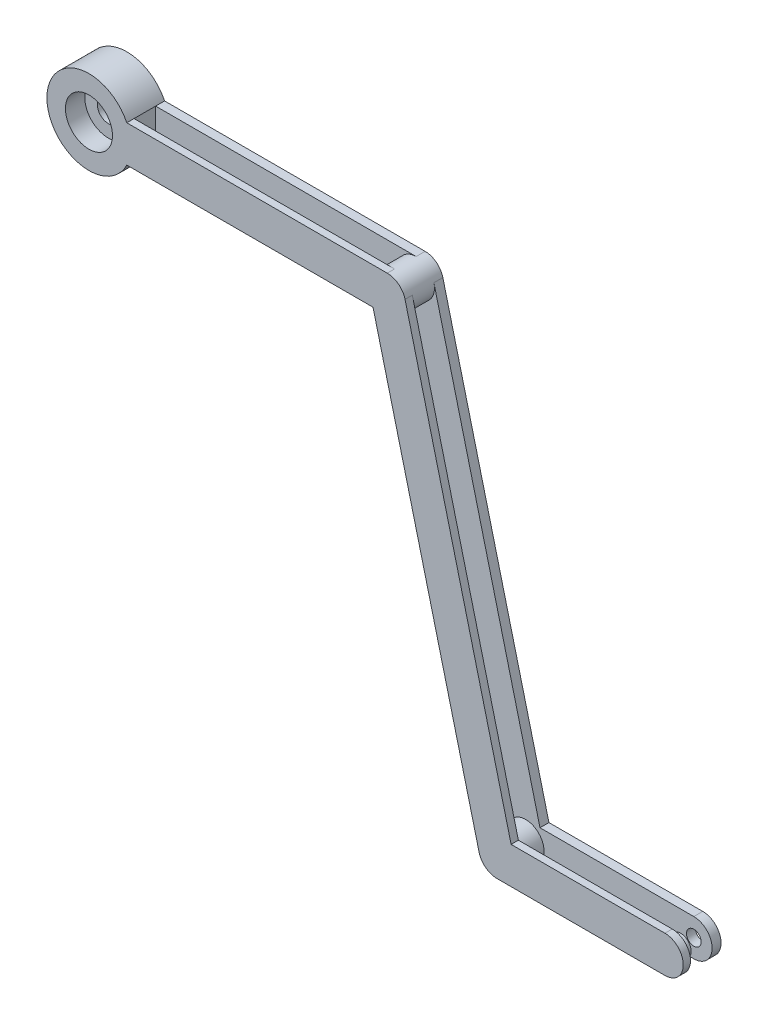
ISO-10303-21;
HEADER;
FILE_DESCRIPTION(('STEP AP214'),'2;1');
FILE_NAME('part.step','',(''),(''),'','','');
FILE_SCHEMA(('AUTOMOTIVE_DESIGN { 1 0 10303 214 1 1 1 1 }'));
ENDSEC;
DATA;
#1=APPLICATION_CONTEXT('core data for automotive mechanical design processes');
#2=APPLICATION_PROTOCOL_DEFINITION('international standard','automotive_design',2000,#1);
#3=PRODUCT_CONTEXT('',#1,'mechanical');
#4=PRODUCT('Part','Part','',(#3));
#5=PRODUCT_RELATED_PRODUCT_CATEGORY('part','',(#4));
#6=PRODUCT_DEFINITION_FORMATION('','',#4);
#7=PRODUCT_DEFINITION_CONTEXT('part definition',#1,'design');
#8=PRODUCT_DEFINITION('design','',#6,#7);
#9=PRODUCT_DEFINITION_SHAPE('','',#8);
#10=(LENGTH_UNIT() NAMED_UNIT(*) SI_UNIT(.MILLI.,.METRE.));
#11=(NAMED_UNIT(*) PLANE_ANGLE_UNIT() SI_UNIT($,.RADIAN.));
#12=(NAMED_UNIT(*) SI_UNIT($,.STERADIAN.) SOLID_ANGLE_UNIT());
#13=UNCERTAINTY_MEASURE_WITH_UNIT(LENGTH_MEASURE(1.E-05),#10,'distance_accuracy_value','');
#14=(GEOMETRIC_REPRESENTATION_CONTEXT(3) GLOBAL_UNCERTAINTY_ASSIGNED_CONTEXT((#13)) GLOBAL_UNIT_ASSIGNED_CONTEXT((#10,
#11,#12)) REPRESENTATION_CONTEXT('',''));
#15=CARTESIAN_POINT('',(0.,0.,0.));
#16=DIRECTION('',(0.,0.,1.));
#17=DIRECTION('',(1.,0.,0.));
#18=AXIS2_PLACEMENT_3D('',#15,#16,#17);
#19=CARTESIAN_POINT('',(0.,-107.358898943541,9.));
#20=DIRECTION('',(0.,1.,0.));
#21=DIRECTION('',(0.,0.,1.));
#22=AXIS2_PLACEMENT_3D('',#19,#20,#21);
#23=PLANE('',#22);
#24=DIRECTION('',(0.,0.,-1.));
#25=VECTOR('',#24,1.);
#26=CARTESIAN_POINT('',(137.080968946948,-107.358898943541,9.));
#27=LINE('',#26,#25);
#28=CARTESIAN_POINT('',(137.080968946948,-107.358898943541,0.));
#29=VERTEX_POINT('',#28);
#30=CARTESIAN_POINT('',(137.080968946948,-107.358898943541,-1.72985231859176));
#31=VERTEX_POINT('',#30);
#32=EDGE_CURVE('E11',#29,#31,#27,.T.);
#33=ORIENTED_EDGE('',*,*,#32,.F.);
#34=DIRECTION('',(-1.,0.,0.));
#35=VECTOR('',#34,1.);
#36=CARTESIAN_POINT('',(-10.,-107.358898943541,0.));
#37=LINE('',#36,#35);
#38=CARTESIAN_POINT('',(97.0809689469479,-107.358898943541,0.));
#39=VERTEX_POINT('',#38);
#40=EDGE_CURVE('E195',#29,#39,#37,.T.);
#41=ORIENTED_EDGE('',*,*,#40,.T.);
#42=DIRECTION('',(0.,0.,-1.));
#43=VECTOR('',#42,1.);
#44=CARTESIAN_POINT('',(97.0809689469479,-107.358898943541,9.));
#45=LINE('',#44,#43);
#46=CARTESIAN_POINT('',(97.0809689469479,-107.358898943541,-1.72985231859176));
#47=VERTEX_POINT('',#46);
#48=EDGE_CURVE('E205',#39,#47,#45,.T.);
#49=ORIENTED_EDGE('',*,*,#48,.T.);
#50=DIRECTION('',(-1.,0.,0.));
#51=VECTOR('',#50,1.);
#52=CARTESIAN_POINT('',(141.439867890489,-107.358898943541,-1.72985231859176));
#53=LINE('',#52,#51);
#54=EDGE_CURVE('E204',#31,#47,#53,.T.);
#55=ORIENTED_EDGE('',*,*,#54,.F.);
#56=EDGE_LOOP('',(#33,#41,#49,#55));
#57=FACE_BOUND('',#56,.T.);
#58=ADVANCED_FACE('F46',(#57),#23,.F.);
#59=CARTESIAN_POINT('',(137.080968946948,-103.,9.));
#60=DIRECTION('',(0.,0.,-1.));
#61=DIRECTION('',(-1.,0.,0.));
#62=AXIS2_PLACEMENT_3D('',#59,#60,#61);
#63=CYLINDRICAL_SURFACE('',#62,4.35889894354068);
#64=CARTESIAN_POINT('',(137.080968946948,-103.,0.));
#65=DIRECTION('',(0.,0.,-1.));
#66=DIRECTION('',(-1.,0.,0.));
#67=AXIS2_PLACEMENT_3D('',#64,#65,#66);
#68=CIRCLE('',#67,4.35889894354068);
#69=CARTESIAN_POINT('',(137.080968946948,-98.6411010564593,0.));
#70=VERTEX_POINT('',#69);
#71=EDGE_CURVE('E183',#70,#29,#68,.T.);
#72=ORIENTED_EDGE('',*,*,#71,.T.);
#73=ORIENTED_EDGE('',*,*,#32,.T.);
#74=CARTESIAN_POINT('',(137.080968946948,-103.,-1.72985231859176));
#75=DIRECTION('',(0.,0.,-1.));
#76=DIRECTION('',(-1.,0.,0.));
#77=AXIS2_PLACEMENT_3D('',#74,#75,#76);
#78=CIRCLE('',#77,4.35889894354068);
#79=CARTESIAN_POINT('',(137.080968946948,-98.6411010564593,-1.72985231859176));
#80=VERTEX_POINT('',#79);
#81=EDGE_CURVE('E271',#80,#31,#78,.T.);
#82=ORIENTED_EDGE('',*,*,#81,.F.);
#83=DIRECTION('',(0.,0.,-1.));
#84=VECTOR('',#83,1.);
#85=CARTESIAN_POINT('',(137.080968946948,-98.6411010564593,9.));
#86=LINE('',#85,#84);
#87=EDGE_CURVE('E55',#70,#80,#86,.T.);
#88=ORIENTED_EDGE('',*,*,#87,.F.);
#89=EDGE_LOOP('',(#72,#73,#82,#88));
#90=FACE_BOUND('',#89,.T.);
#91=ADVANCED_FACE('F185',(#90),#63,.T.);
#92=CARTESIAN_POINT('',(0.,-98.6411010564593,9.));
#93=DIRECTION('',(0.,1.,0.));
#94=DIRECTION('',(0.,0.,1.));
#95=AXIS2_PLACEMENT_3D('',#92,#93,#94);
#96=PLANE('',#95);
#97=DIRECTION('',(-1.,0.,0.));
#98=VECTOR('',#97,1.);
#99=CARTESIAN_POINT('',(0.,-98.6411010564593,0.));
#100=LINE('',#99,#98);
#101=CARTESIAN_POINT('',(100.473705575307,-98.6411010564593,0.));
#102=VERTEX_POINT('',#101);
#103=EDGE_CURVE('E192',#70,#102,#100,.T.);
#104=ORIENTED_EDGE('',*,*,#103,.F.);
#105=ORIENTED_EDGE('',*,*,#87,.T.);
#106=DIRECTION('',(-1.,0.,0.));
#107=VECTOR('',#106,1.);
#108=CARTESIAN_POINT('',(0.,-98.6411010564593,-1.72985231859176));
#109=LINE('',#108,#107);
#110=CARTESIAN_POINT('',(100.473705575307,-98.6411010564593,-1.72985231859176));
#111=VERTEX_POINT('',#110);
#112=EDGE_CURVE('E267',#80,#111,#109,.T.);
#113=ORIENTED_EDGE('',*,*,#112,.T.);
#114=DIRECTION('',(0.,0.,-1.));
#115=VECTOR('',#114,1.);
#116=CARTESIAN_POINT('',(100.473705575307,-98.6411010564593,9.));
#117=LINE('',#116,#115);
#118=EDGE_CURVE('E391',#102,#111,#117,.T.);
#119=ORIENTED_EDGE('',*,*,#118,.F.);
#120=EDGE_LOOP('',(#104,#105,#113,#119));
#121=FACE_BOUND('',#120,.T.);
#122=ADVANCED_FACE('F397',(#121),#96,.T.);
#123=CARTESIAN_POINT('',(70.9475272540212,17.9648568463579,9.));
#124=DIRECTION('',(0.969405133703911,0.245466263972268,0.));
#125=DIRECTION('',(-0.245466263972268,0.969405133703911,0.));
#126=AXIS2_PLACEMENT_3D('',#123,#124,#125);
#127=PLANE('',#126);
#128=DIRECTION('',(-0.245466263972268,0.969405133703911,0.));
#129=VECTOR('',#128,1.);
#130=CARTESIAN_POINT('',(70.9475272540212,17.9648568463579,0.));
#131=LINE('',#130,#129);
#132=CARTESIAN_POINT('',(75.2255390131649,1.06996263870359,0.));
#133=VERTEX_POINT('',#132);
#134=EDGE_CURVE('E408',#102,#133,#131,.T.);
#135=ORIENTED_EDGE('',*,*,#134,.F.);
#136=ORIENTED_EDGE('',*,*,#118,.T.);
#137=DIRECTION('',(-0.245466263972268,0.969405133703911,0.));
#138=VECTOR('',#137,1.);
#139=CARTESIAN_POINT('',(70.9475272540212,17.9648568463579,-1.72985231859176));
#140=LINE('',#139,#138);
#141=CARTESIAN_POINT('',(75.2255390131649,1.0699626387036,-1.72985231859176));
#142=VERTEX_POINT('',#141);
#143=EDGE_CURVE('E263',#111,#142,#140,.T.);
#144=ORIENTED_EDGE('',*,*,#143,.T.);
#145=DIRECTION('',(0.,0.,-1.));
#146=VECTOR('',#145,1.);
#147=CARTESIAN_POINT('',(75.2255390131649,1.0699626387036,9.));
#148=LINE('',#147,#146);
#149=EDGE_CURVE('E388',#133,#142,#148,.T.);
#150=ORIENTED_EDGE('',*,*,#149,.F.);
#151=EDGE_LOOP('',(#135,#136,#144,#150));
#152=FACE_BOUND('',#151,.T.);
#153=ADVANCED_FACE('F407',(#152),#127,.T.);
#154=CARTESIAN_POINT('',(0.,4.35889894354067,9.));
#155=DIRECTION('',(0.,1.,0.));
#156=DIRECTION('',(0.,0.,1.));
#157=AXIS2_PLACEMENT_3D('',#154,#155,#156);
#158=PLANE('',#157);
#159=DIRECTION('',(-1.,0.,0.));
#160=VECTOR('',#159,1.);
#161=CARTESIAN_POINT('',(0.,4.35889894354067,0.));
#162=LINE('',#161,#160);
#163=CARTESIAN_POINT('',(71.,4.35889894354067,0.));
#164=VERTEX_POINT('',#163);
#165=CARTESIAN_POINT('',(9.,4.35889894354067,0.));
#166=VERTEX_POINT('',#165);
#167=EDGE_CURVE('E416',#164,#166,#162,.T.);
#168=ORIENTED_EDGE('',*,*,#167,.F.);
#169=DIRECTION('',(0.,0.,-1.));
#170=VECTOR('',#169,1.);
#171=CARTESIAN_POINT('',(71.,4.35889894354067,9.));
#172=LINE('',#171,#170);
#173=CARTESIAN_POINT('',(71.,4.35889894354067,-1.72985231859176));
#174=VERTEX_POINT('',#173);
#175=EDGE_CURVE('E385',#164,#174,#172,.T.);
#176=ORIENTED_EDGE('',*,*,#175,.T.);
#177=DIRECTION('',(-1.,0.,0.));
#178=VECTOR('',#177,1.);
#179=CARTESIAN_POINT('',(141.439867890489,4.35889894354067,-1.72985231859176));
#180=LINE('',#179,#178);
#181=CARTESIAN_POINT('',(9.,4.35889894354067,-1.72985231859176));
#182=VERTEX_POINT('',#181);
#183=EDGE_CURVE('E224',#174,#182,#180,.T.);
#184=ORIENTED_EDGE('',*,*,#183,.T.);
#185=DIRECTION('',(0.,0.,-1.));
#186=VECTOR('',#185,1.);
#187=CARTESIAN_POINT('',(9.,4.35889894354067,9.));
#188=LINE('',#187,#186);
#189=EDGE_CURVE('E382',#166,#182,#188,.T.);
#190=ORIENTED_EDGE('',*,*,#189,.F.);
#191=EDGE_LOOP('',(#168,#176,#184,#190));
#192=FACE_BOUND('',#191,.T.);
#193=ADVANCED_FACE('F456',(#192),#158,.T.);
#194=CARTESIAN_POINT('',(0.,-4.35889894354067,9.));
#195=DIRECTION('',(0.,1.,0.));
#196=DIRECTION('',(-1.,0.,0.));
#197=AXIS2_PLACEMENT_3D('',#194,#195,#196);
#198=PLANE('',#197);
#199=DIRECTION('',(0.,0.,-1.));
#200=VECTOR('',#199,1.);
#201=CARTESIAN_POINT('',(67.6072633716404,-4.35889894354067,9.));
#202=LINE('',#201,#200);
#203=CARTESIAN_POINT('',(67.6072633716404,-4.35889894354067,0.));
#204=VERTEX_POINT('',#203);
#205=CARTESIAN_POINT('',(67.6072633716404,-4.35889894354067,-1.72985231859176));
#206=VERTEX_POINT('',#205);
#207=EDGE_CURVE('E376',#204,#206,#202,.T.);
#208=ORIENTED_EDGE('',*,*,#207,.F.);
#209=DIRECTION('',(-1.,0.,0.));
#210=VECTOR('',#209,1.);
#211=CARTESIAN_POINT('',(0.,-4.35889894354067,0.));
#212=LINE('',#211,#210);
#213=CARTESIAN_POINT('',(9.,-4.35889894354067,0.));
#214=VERTEX_POINT('',#213);
#215=EDGE_CURVE('E443',#204,#214,#212,.T.);
#216=ORIENTED_EDGE('',*,*,#215,.T.);
#217=DIRECTION('',(0.,0.,-1.));
#218=VECTOR('',#217,1.);
#219=CARTESIAN_POINT('',(9.,-4.35889894354067,9.));
#220=LINE('',#219,#218);
#221=CARTESIAN_POINT('',(9.,-4.3588989435407,-1.72985231859176));
#222=VERTEX_POINT('',#221);
#223=EDGE_CURVE('E379',#214,#222,#220,.T.);
#224=ORIENTED_EDGE('',*,*,#223,.T.);
#225=DIRECTION('',(-1.,0.,0.));
#226=VECTOR('',#225,1.);
#227=CARTESIAN_POINT('',(0.,-4.35889894354067,-1.72985231859176));
#228=LINE('',#227,#226);
#229=EDGE_CURVE('E259',#206,#222,#228,.T.);
#230=ORIENTED_EDGE('',*,*,#229,.F.);
#231=EDGE_LOOP('',(#208,#216,#224,#230));
#232=FACE_BOUND('',#231,.T.);
#233=ADVANCED_FACE('F442',(#232),#198,.F.);
#234=CARTESIAN_POINT('',(62.4964492276914,15.8249315689507,9.));
#235=DIRECTION('',(0.969405133703911,0.245466263972268,0.));
#236=DIRECTION('',(-0.245466263972268,0.969405133703911,0.));
#237=AXIS2_PLACEMENT_3D('',#234,#235,#236);
#238=PLANE('',#237);
#239=DIRECTION('',(0.,0.,-1.));
#240=VECTOR('',#239,1.);
#241=CARTESIAN_POINT('',(92.855429933783,-104.069962638704,9.));
#242=LINE('',#241,#240);
#243=CARTESIAN_POINT('',(92.855429933783,-104.069962638704,0.));
#244=VERTEX_POINT('',#243);
#245=CARTESIAN_POINT('',(92.855429933783,-104.069962638704,-1.72985231859176));
#246=VERTEX_POINT('',#245);
#247=EDGE_CURVE('E373',#244,#246,#242,.T.);
#248=ORIENTED_EDGE('',*,*,#247,.F.);
#249=DIRECTION('',(-0.245466263972268,0.969405133703911,0.));
#250=VECTOR('',#249,1.);
#251=CARTESIAN_POINT('',(62.4964492276914,15.8249315689507,0.));
#252=LINE('',#251,#250);
#253=EDGE_CURVE('E62',#244,#204,#252,.T.);
#254=ORIENTED_EDGE('',*,*,#253,.T.);
#255=ORIENTED_EDGE('',*,*,#207,.T.);
#256=DIRECTION('',(-0.245466263972268,0.969405133703911,0.));
#257=VECTOR('',#256,1.);
#258=CARTESIAN_POINT('',(62.4964492276914,15.8249315689507,-1.72985231859176));
#259=LINE('',#258,#257);
#260=EDGE_CURVE('E255',#246,#206,#259,.T.);
#261=ORIENTED_EDGE('',*,*,#260,.F.);
#262=EDGE_LOOP('',(#248,#254,#255,#261));
#263=FACE_BOUND('',#262,.T.);
#264=ADVANCED_FACE('F438',(#263),#238,.F.);
#265=CARTESIAN_POINT('',(71.,0.,9.));
#266=DIRECTION('',(0.,0.,-1.));
#267=DIRECTION('',(-1.,0.,0.));
#268=AXIS2_PLACEMENT_3D('',#265,#266,#267);
#269=CYLINDRICAL_SURFACE('',#268,4.35889894354068);
#270=ORIENTED_EDGE('',*,*,#175,.F.);
#271=CARTESIAN_POINT('',(71.,0.,0.));
#272=DIRECTION('',(0.,0.,-1.));
#273=DIRECTION('',(-1.,0.,0.));
#274=AXIS2_PLACEMENT_3D('',#271,#272,#273);
#275=CIRCLE('',#274,4.35889894354068);
#276=EDGE_CURVE('E411',#164,#133,#275,.T.);
#277=ORIENTED_EDGE('',*,*,#276,.T.);
#278=ORIENTED_EDGE('',*,*,#149,.T.);
#279=CARTESIAN_POINT('',(71.,0.,-1.72985231859176));
#280=DIRECTION('',(0.,0.,-1.));
#281=DIRECTION('',(-1.,0.,0.));
#282=AXIS2_PLACEMENT_3D('',#279,#280,#281);
#283=CIRCLE('',#282,4.35889894354068);
#284=EDGE_CURVE('E221',#174,#142,#283,.F.);
#285=ORIENTED_EDGE('',*,*,#284,.F.);
#286=EDGE_LOOP('',(#270,#277,#278,#285));
#287=FACE_BOUND('',#286,.T.);
#288=DIRECTION('',(0.,0.,1.));
#289=VECTOR('',#288,1.);
#290=CARTESIAN_POINT('',(75.2255390131649,1.0699626387036,-9.));
#291=LINE('',#290,#289);
#292=CARTESIAN_POINT('',(75.2255390131649,1.0699626387036,-9.));
#293=VERTEX_POINT('',#292);
#294=CARTESIAN_POINT('',(75.2255390131649,1.06996263870359,-6.86957819147113));
#295=VERTEX_POINT('',#294);
#296=EDGE_CURVE('E342',#293,#295,#291,.T.);
#297=ORIENTED_EDGE('',*,*,#296,.F.);
#298=CARTESIAN_POINT('',(71.,0.,-9.));
#299=DIRECTION('',(0.,0.,1.));
#300=DIRECTION('',(1.,0.,0.));
#301=AXIS2_PLACEMENT_3D('',#298,#299,#300);
#302=CIRCLE('',#301,4.35889894354068);
#303=CARTESIAN_POINT('',(71.,4.35889894354067,-9.));
#304=VERTEX_POINT('',#303);
#305=EDGE_CURVE('E297',#293,#304,#302,.T.);
#306=ORIENTED_EDGE('',*,*,#305,.T.);
#307=DIRECTION('',(0.,0.,1.));
#308=VECTOR('',#307,1.);
#309=CARTESIAN_POINT('',(71.,4.35889894354067,-9.));
#310=LINE('',#309,#308);
#311=CARTESIAN_POINT('',(71.,4.35889894354067,-6.86957819147113));
#312=VERTEX_POINT('',#311);
#313=EDGE_CURVE('E338',#304,#312,#310,.T.);
#314=ORIENTED_EDGE('',*,*,#313,.T.);
#315=CARTESIAN_POINT('',(71.,0.,-6.86957819147113));
#316=DIRECTION('',(0.,0.,1.));
#317=DIRECTION('',(1.,0.,0.));
#318=AXIS2_PLACEMENT_3D('',#315,#316,#317);
#319=CIRCLE('',#318,4.35889894354068);
#320=EDGE_CURVE('E358',#312,#295,#319,.T.);
#321=ORIENTED_EDGE('',*,*,#320,.T.);
#322=EDGE_LOOP('',(#297,#306,#314,#321));
#323=FACE_BOUND('',#322,.T.);
#324=ADVANCED_FACE('F460',(#287,#323),#269,.T.);
#325=CARTESIAN_POINT('',(0.,0.,9.));
#326=DIRECTION('',(0.,0.,-1.));
#327=DIRECTION('',(-1.,0.,0.));
#328=AXIS2_PLACEMENT_3D('',#325,#326,#327);
#329=CYLINDRICAL_SURFACE('',#328,10.);
#330=CARTESIAN_POINT('',(0.,0.,0.));
#331=DIRECTION('',(0.,0.,-1.));
#332=DIRECTION('',(-1.,0.,0.));
#333=AXIS2_PLACEMENT_3D('',#330,#331,#332);
#334=CIRCLE('',#333,10.);
#335=EDGE_CURVE('E462',#214,#166,#334,.T.);
#336=ORIENTED_EDGE('',*,*,#335,.T.);
#337=ORIENTED_EDGE('',*,*,#189,.T.);
#338=DIRECTION('',(0.,0.,-1.));
#339=VECTOR('',#338,1.);
#340=CARTESIAN_POINT('',(9.,4.35889894354067,-1.72985231859176));
#341=LINE('',#340,#339);
#342=CARTESIAN_POINT('',(9.,4.35889894354067,-6.86957819147113));
#343=VERTEX_POINT('',#342);
#344=EDGE_CURVE('E218',#182,#343,#341,.T.);
#345=ORIENTED_EDGE('',*,*,#344,.T.);
#346=DIRECTION('',(0.,0.,1.));
#347=VECTOR('',#346,1.);
#348=CARTESIAN_POINT('',(9.,4.35889894354067,-9.));
#349=LINE('',#348,#347);
#350=CARTESIAN_POINT('',(9.,4.35889894354067,-9.));
#351=VERTEX_POINT('',#350);
#352=EDGE_CURVE('E334',#351,#343,#349,.T.);
#353=ORIENTED_EDGE('',*,*,#352,.F.);
#354=CARTESIAN_POINT('',(0.,0.,-9.));
#355=DIRECTION('',(0.,0.,1.));
#356=DIRECTION('',(1.,0.,0.));
#357=AXIS2_PLACEMENT_3D('',#354,#355,#356);
#358=CIRCLE('',#357,10.);
#359=CARTESIAN_POINT('',(9.,-4.35889894354067,-9.));
#360=VERTEX_POINT('',#359);
#361=EDGE_CURVE('E304',#351,#360,#358,.T.);
#362=ORIENTED_EDGE('',*,*,#361,.T.);
#363=DIRECTION('',(0.,0.,1.));
#364=VECTOR('',#363,1.);
#365=CARTESIAN_POINT('',(9.,-4.35889894354067,-9.));
#366=LINE('',#365,#364);
#367=CARTESIAN_POINT('',(9.,-4.3588989435407,-6.86957819147113));
#368=VERTEX_POINT('',#367);
#369=EDGE_CURVE('E330',#360,#368,#366,.T.);
#370=ORIENTED_EDGE('',*,*,#369,.T.);
#371=EDGE_CURVE('E329',#368,#222,#366,.T.);
#372=ORIENTED_EDGE('',*,*,#371,.T.);
#373=ORIENTED_EDGE('',*,*,#223,.F.);
#374=EDGE_LOOP('',(#336,#337,#345,#353,#362,#370,#372,#373));
#375=FACE_BOUND('',#374,.T.);
#376=ADVANCED_FACE('F502',(#375),#329,.T.);
#377=CARTESIAN_POINT('',(97.0809689469479,-103.,9.));
#378=DIRECTION('',(0.,0.,-1.));
#379=DIRECTION('',(-1.,0.,0.));
#380=AXIS2_PLACEMENT_3D('',#377,#378,#379);
#381=CYLINDRICAL_SURFACE('',#380,4.35889894354068);
#382=ORIENTED_EDGE('',*,*,#48,.F.);
#383=CARTESIAN_POINT('',(97.0809689469479,-103.,0.));
#384=DIRECTION('',(0.,0.,-1.));
#385=DIRECTION('',(-1.,0.,0.));
#386=AXIS2_PLACEMENT_3D('',#383,#384,#385);
#387=CIRCLE('',#386,4.35889894354068);
#388=EDGE_CURVE('E197',#39,#244,#387,.T.);
#389=ORIENTED_EDGE('',*,*,#388,.T.);
#390=ORIENTED_EDGE('',*,*,#247,.T.);
#391=CARTESIAN_POINT('',(97.0809689469479,-103.,-1.72985231859176));
#392=DIRECTION('',(0.,0.,-1.));
#393=DIRECTION('',(-1.,0.,0.));
#394=AXIS2_PLACEMENT_3D('',#391,#392,#393);
#395=CIRCLE('',#394,4.35889894354069);
#396=EDGE_CURVE('E430',#47,#246,#395,.F.);
#397=ORIENTED_EDGE('',*,*,#396,.F.);
#398=EDGE_LOOP('',(#382,#389,#390,#397));
#399=FACE_BOUND('',#398,.T.);
#400=DIRECTION('',(0.,0.,1.));
#401=VECTOR('',#400,1.);
#402=CARTESIAN_POINT('',(92.855429933783,-104.069962638704,-9.));
#403=LINE('',#402,#401);
#404=CARTESIAN_POINT('',(92.855429933783,-104.069962638704,-9.));
#405=VERTEX_POINT('',#404);
#406=CARTESIAN_POINT('',(92.855429933783,-104.069962638704,-6.86957819147113));
#407=VERTEX_POINT('',#406);
#408=EDGE_CURVE('E321',#405,#407,#403,.T.);
#409=ORIENTED_EDGE('',*,*,#408,.F.);
#410=CARTESIAN_POINT('',(97.0809689469479,-103.,-9.));
#411=DIRECTION('',(0.,0.,1.));
#412=DIRECTION('',(1.,0.,0.));
#413=AXIS2_PLACEMENT_3D('',#410,#411,#412);
#414=CIRCLE('',#413,4.35889894354068);
#415=CARTESIAN_POINT('',(97.0809689469479,-107.358898943541,-9.));
#416=VERTEX_POINT('',#415);
#417=EDGE_CURVE('E70',#405,#416,#414,.T.);
#418=ORIENTED_EDGE('',*,*,#417,.T.);
#419=DIRECTION('',(0.,0.,1.));
#420=VECTOR('',#419,1.);
#421=CARTESIAN_POINT('',(97.0809689469479,-107.358898943541,-9.));
#422=LINE('',#421,#420);
#423=CARTESIAN_POINT('',(97.0809689469479,-107.358898943541,-6.86957819147113));
#424=VERTEX_POINT('',#423);
#425=EDGE_CURVE('E318',#416,#424,#422,.T.);
#426=ORIENTED_EDGE('',*,*,#425,.T.);
#427=CARTESIAN_POINT('',(97.0809689469479,-103.,-6.86957819147113));
#428=DIRECTION('',(0.,0.,1.));
#429=DIRECTION('',(1.,0.,0.));
#430=AXIS2_PLACEMENT_3D('',#427,#428,#429);
#431=CIRCLE('',#430,4.35889894354069);
#432=EDGE_CURVE('E364',#424,#407,#431,.T.);
#433=ORIENTED_EDGE('',*,*,#432,.T.);
#434=EDGE_LOOP('',(#409,#418,#426,#433));
#435=FACE_BOUND('',#434,.T.);
#436=ADVANCED_FACE('F507',(#399,#435),#381,.T.);
#437=CARTESIAN_POINT('',(0.,0.,4.6));
#438=DIRECTION('',(0.,0.,-1.));
#439=DIRECTION('',(-1.,0.,0.));
#440=AXIS2_PLACEMENT_3D('',#437,#438,#439);
#441=CYLINDRICAL_SURFACE('',#440,5.6);
#442=CARTESIAN_POINT('',(0.,0.,0.));
#443=DIRECTION('',(0.,0.,-1.));
#444=DIRECTION('',(-1.,0.,0.));
#445=AXIS2_PLACEMENT_3D('',#442,#443,#444);
#446=CIRCLE('',#445,5.6);
#447=CARTESIAN_POINT('',(-5.6,0.,0.));
#448=VERTEX_POINT('',#447);
#449=EDGE_CURVE('E49',#448,#448,#446,.F.);
#450=ORIENTED_EDGE('',*,*,#449,.T.);
#451=EDGE_LOOP('',(#450));
#452=FACE_BOUND('',#451,.T.);
#453=CARTESIAN_POINT('',(0.,0.,-4.6));
#454=DIRECTION('',(0.,0.,-1.));
#455=DIRECTION('',(-1.,0.,0.));
#456=AXIS2_PLACEMENT_3D('',#453,#454,#455);
#457=CIRCLE('',#456,5.6);
#458=CARTESIAN_POINT('',(-5.6,0.,-4.6));
#459=VERTEX_POINT('',#458);
#460=EDGE_CURVE('E279',#459,#459,#457,.T.);
#461=ORIENTED_EDGE('',*,*,#460,.T.);
#462=EDGE_LOOP('',(#461));
#463=FACE_BOUND('',#462,.T.);
#464=ADVANCED_FACE('F476',(#452,#463),#441,.F.);
#465=CARTESIAN_POINT('',(0.,-107.358898943541,-9.));
#466=DIRECTION('',(0.,1.,0.));
#467=DIRECTION('',(0.,0.,-1.));
#468=AXIS2_PLACEMENT_3D('',#465,#466,#467);
#469=PLANE('',#468);
#470=ORIENTED_EDGE('',*,*,#425,.F.);
#471=DIRECTION('',(1.,0.,0.));
#472=VECTOR('',#471,1.);
#473=CARTESIAN_POINT('',(0.,-107.358898943541,-9.));
#474=LINE('',#473,#472);
#475=CARTESIAN_POINT('',(137.080968946948,-107.358898943541,-9.));
#476=VERTEX_POINT('',#475);
#477=EDGE_CURVE('E283',#416,#476,#474,.T.);
#478=ORIENTED_EDGE('',*,*,#477,.T.);
#479=DIRECTION('',(0.,0.,1.));
#480=VECTOR('',#479,1.);
#481=CARTESIAN_POINT('',(137.080968946948,-107.358898943541,-9.));
#482=LINE('',#481,#480);
#483=CARTESIAN_POINT('',(137.080968946948,-107.358898943541,-6.86957819147113));
#484=VERTEX_POINT('',#483);
#485=EDGE_CURVE('E354',#476,#484,#482,.T.);
#486=ORIENTED_EDGE('',*,*,#485,.T.);
#487=DIRECTION('',(1.,0.,0.));
#488=VECTOR('',#487,1.);
#489=CARTESIAN_POINT('',(9.,-107.358898943541,-6.86957819147113));
#490=LINE('',#489,#488);
#491=EDGE_CURVE('E210',#424,#484,#490,.T.);
#492=ORIENTED_EDGE('',*,*,#491,.F.);
#493=EDGE_LOOP('',(#470,#478,#486,#492));
#494=FACE_BOUND('',#493,.T.);
#495=ADVANCED_FACE('F515',(#494),#469,.F.);
#496=CARTESIAN_POINT('',(137.080968946948,-103.,-9.));
#497=DIRECTION('',(0.,0.,1.));
#498=DIRECTION('',(-1.,0.,0.));
#499=AXIS2_PLACEMENT_3D('',#496,#497,#498);
#500=CYLINDRICAL_SURFACE('',#499,4.35889894354068);
#501=CARTESIAN_POINT('',(137.080968946948,-103.,-6.86957819147113));
#502=DIRECTION('',(0.,0.,1.));
#503=DIRECTION('',(1.,0.,0.));
#504=AXIS2_PLACEMENT_3D('',#501,#502,#503);
#505=CIRCLE('',#504,4.35889894354068);
#506=CARTESIAN_POINT('',(137.080968946948,-98.6411010564593,-6.86957819147113));
#507=VERTEX_POINT('',#506);
#508=EDGE_CURVE('E251',#484,#507,#505,.T.);
#509=ORIENTED_EDGE('',*,*,#508,.F.);
#510=ORIENTED_EDGE('',*,*,#485,.F.);
#511=CARTESIAN_POINT('',(137.080968946948,-103.,-9.));
#512=DIRECTION('',(0.,0.,1.));
#513=DIRECTION('',(1.,0.,0.));
#514=AXIS2_PLACEMENT_3D('',#511,#512,#513);
#515=CIRCLE('',#514,4.35889894354068);
#516=CARTESIAN_POINT('',(137.080968946948,-98.6411010564593,-9.));
#517=VERTEX_POINT('',#516);
#518=EDGE_CURVE('E287',#476,#517,#515,.T.);
#519=ORIENTED_EDGE('',*,*,#518,.T.);
#520=DIRECTION('',(0.,0.,1.));
#521=VECTOR('',#520,1.);
#522=CARTESIAN_POINT('',(137.080968946948,-98.6411010564593,-9.));
#523=LINE('',#522,#521);
#524=EDGE_CURVE('E350',#517,#507,#523,.T.);
#525=ORIENTED_EDGE('',*,*,#524,.T.);
#526=EDGE_LOOP('',(#509,#510,#519,#525));
#527=FACE_BOUND('',#526,.T.);
#528=ADVANCED_FACE('F518',(#527),#500,.T.);
#529=CARTESIAN_POINT('',(0.,-98.6411010564593,-9.));
#530=DIRECTION('',(0.,1.,0.));
#531=DIRECTION('',(0.,0.,-1.));
#532=AXIS2_PLACEMENT_3D('',#529,#530,#531);
#533=PLANE('',#532);
#534=DIRECTION('',(1.,0.,0.));
#535=VECTOR('',#534,1.);
#536=CARTESIAN_POINT('',(0.,-98.6411010564593,-6.86957819147113));
#537=LINE('',#536,#535);
#538=CARTESIAN_POINT('',(100.473705575307,-98.6411010564593,-6.86957819147113));
#539=VERTEX_POINT('',#538);
#540=EDGE_CURVE('E248',#539,#507,#537,.T.);
#541=ORIENTED_EDGE('',*,*,#540,.T.);
#542=ORIENTED_EDGE('',*,*,#524,.F.);
#543=DIRECTION('',(1.,0.,0.));
#544=VECTOR('',#543,1.);
#545=CARTESIAN_POINT('',(0.,-98.6411010564593,-9.));
#546=LINE('',#545,#544);
#547=CARTESIAN_POINT('',(100.473705575307,-98.6411010564593,-9.));
#548=VERTEX_POINT('',#547);
#549=EDGE_CURVE('E291',#548,#517,#546,.T.);
#550=ORIENTED_EDGE('',*,*,#549,.F.);
#551=DIRECTION('',(0.,0.,1.));
#552=VECTOR('',#551,1.);
#553=CARTESIAN_POINT('',(100.473705575307,-98.6411010564593,-9.));
#554=LINE('',#553,#552);
#555=EDGE_CURVE('E346',#548,#539,#554,.T.);
#556=ORIENTED_EDGE('',*,*,#555,.T.);
#557=EDGE_LOOP('',(#541,#542,#550,#556));
#558=FACE_BOUND('',#557,.T.);
#559=ADVANCED_FACE('F522',(#558),#533,.T.);
#560=CARTESIAN_POINT('',(70.9475272540212,17.9648568463579,-9.));
#561=DIRECTION('',(0.969405133703911,0.245466263972268,0.));
#562=DIRECTION('',(-0.245466263972268,0.969405133703911,0.));
#563=AXIS2_PLACEMENT_3D('',#560,#561,#562);
#564=PLANE('',#563);
#565=DIRECTION('',(0.245466263972268,-0.969405133703911,0.));
#566=VECTOR('',#565,1.);
#567=CARTESIAN_POINT('',(70.9475272540212,17.9648568463579,-6.86957819147113));
#568=LINE('',#567,#566);
#569=EDGE_CURVE('E245',#295,#539,#568,.T.);
#570=ORIENTED_EDGE('',*,*,#569,.T.);
#571=ORIENTED_EDGE('',*,*,#555,.F.);
#572=DIRECTION('',(0.245466263972268,-0.969405133703911,0.));
#573=VECTOR('',#572,1.);
#574=CARTESIAN_POINT('',(70.9475272540212,17.9648568463579,-9.));
#575=LINE('',#574,#573);
#576=EDGE_CURVE('E294',#293,#548,#575,.T.);
#577=ORIENTED_EDGE('',*,*,#576,.F.);
#578=ORIENTED_EDGE('',*,*,#296,.T.);
#579=EDGE_LOOP('',(#570,#571,#577,#578));
#580=FACE_BOUND('',#579,.T.);
#581=ADVANCED_FACE('F526',(#580),#564,.T.);
#582=CARTESIAN_POINT('',(0.,4.35889894354067,-9.));
#583=DIRECTION('',(0.,1.,0.));
#584=DIRECTION('',(0.,0.,-1.));
#585=AXIS2_PLACEMENT_3D('',#582,#583,#584);
#586=PLANE('',#585);
#587=DIRECTION('',(1.,0.,0.));
#588=VECTOR('',#587,1.);
#589=CARTESIAN_POINT('',(9.,4.35889894354067,-6.86957819147113));
#590=LINE('',#589,#588);
#591=EDGE_CURVE('E211',#343,#312,#590,.T.);
#592=ORIENTED_EDGE('',*,*,#591,.T.);
#593=ORIENTED_EDGE('',*,*,#313,.F.);
#594=DIRECTION('',(1.,0.,0.));
#595=VECTOR('',#594,1.);
#596=CARTESIAN_POINT('',(0.,4.35889894354067,-9.));
#597=LINE('',#596,#595);
#598=EDGE_CURVE('E301',#351,#304,#597,.T.);
#599=ORIENTED_EDGE('',*,*,#598,.F.);
#600=ORIENTED_EDGE('',*,*,#352,.T.);
#601=EDGE_LOOP('',(#592,#593,#599,#600));
#602=FACE_BOUND('',#601,.T.);
#603=ADVANCED_FACE('F530',(#602),#586,.T.);
#604=CARTESIAN_POINT('',(0.,-4.35889894354067,-9.));
#605=DIRECTION('',(0.,1.,0.));
#606=DIRECTION('',(-1.,0.,0.));
#607=AXIS2_PLACEMENT_3D('',#604,#605,#606);
#608=PLANE('',#607);
#609=ORIENTED_EDGE('',*,*,#369,.F.);
#610=DIRECTION('',(1.,0.,0.));
#611=VECTOR('',#610,1.);
#612=CARTESIAN_POINT('',(0.,-4.35889894354067,-9.));
#613=LINE('',#612,#611);
#614=CARTESIAN_POINT('',(67.6072633716404,-4.35889894354067,-9.));
#615=VERTEX_POINT('',#614);
#616=EDGE_CURVE('E308',#360,#615,#613,.T.);
#617=ORIENTED_EDGE('',*,*,#616,.T.);
#618=DIRECTION('',(0.,0.,1.));
#619=VECTOR('',#618,1.);
#620=CARTESIAN_POINT('',(67.6072633716404,-4.35889894354067,-9.));
#621=LINE('',#620,#619);
#622=CARTESIAN_POINT('',(67.6072633716404,-4.35889894354067,-6.86957819147113));
#623=VERTEX_POINT('',#622);
#624=EDGE_CURVE('E325',#615,#623,#621,.T.);
#625=ORIENTED_EDGE('',*,*,#624,.T.);
#626=DIRECTION('',(1.,0.,0.));
#627=VECTOR('',#626,1.);
#628=CARTESIAN_POINT('',(0.,-4.35889894354067,-6.86957819147113));
#629=LINE('',#628,#627);
#630=EDGE_CURVE('E241',#368,#623,#629,.T.);
#631=ORIENTED_EDGE('',*,*,#630,.F.);
#632=EDGE_LOOP('',(#609,#617,#625,#631));
#633=FACE_BOUND('',#632,.T.);
#634=ADVANCED_FACE('F534',(#633),#608,.F.);
#635=CARTESIAN_POINT('',(62.4964492276914,15.8249315689507,-9.));
#636=DIRECTION('',(0.969405133703911,0.245466263972268,0.));
#637=DIRECTION('',(-0.245466263972268,0.969405133703911,0.));
#638=AXIS2_PLACEMENT_3D('',#635,#636,#637);
#639=PLANE('',#638);
#640=ORIENTED_EDGE('',*,*,#624,.F.);
#641=DIRECTION('',(0.245466263972268,-0.969405133703911,0.));
#642=VECTOR('',#641,1.);
#643=CARTESIAN_POINT('',(62.4964492276914,15.8249315689507,-9.));
#644=LINE('',#643,#642);
#645=EDGE_CURVE('E312',#615,#405,#644,.T.);
#646=ORIENTED_EDGE('',*,*,#645,.T.);
#647=ORIENTED_EDGE('',*,*,#408,.T.);
#648=DIRECTION('',(0.245466263972268,-0.969405133703911,0.));
#649=VECTOR('',#648,1.);
#650=CARTESIAN_POINT('',(62.4964492276914,15.8249315689507,-6.86957819147113));
#651=LINE('',#650,#649);
#652=EDGE_CURVE('E234',#623,#407,#651,.T.);
#653=ORIENTED_EDGE('',*,*,#652,.F.);
#654=EDGE_LOOP('',(#640,#646,#647,#653));
#655=FACE_BOUND('',#654,.T.);
#656=ADVANCED_FACE('F538',(#655),#639,.F.);
#657=CARTESIAN_POINT('',(0.,0.,-9.));
#658=DIRECTION('',(0.,0.,-1.));
#659=DIRECTION('',(1.,0.,0.));
#660=AXIS2_PLACEMENT_3D('',#657,#658,#659);
#661=PLANE('',#660);
#662=CARTESIAN_POINT('',(137.080968946948,-103.,-9.));
#663=DIRECTION('',(0.,0.,1.));
#664=DIRECTION('',(1.,0.,0.));
#665=AXIS2_PLACEMENT_3D('',#662,#663,#664);
#666=CIRCLE('',#665,1.75000000000001);
#667=CARTESIAN_POINT('',(138.830968946948,-103.,-9.));
#668=VERTEX_POINT('',#667);
#669=EDGE_CURVE('E191',#668,#668,#666,.T.);
#670=ORIENTED_EDGE('',*,*,#669,.T.);
#671=EDGE_LOOP('',(#670));
#672=FACE_BOUND('',#671,.T.);
#673=ORIENTED_EDGE('',*,*,#645,.F.);
#674=ORIENTED_EDGE('',*,*,#616,.F.);
#675=ORIENTED_EDGE('',*,*,#361,.F.);
#676=ORIENTED_EDGE('',*,*,#598,.T.);
#677=ORIENTED_EDGE('',*,*,#305,.F.);
#678=ORIENTED_EDGE('',*,*,#576,.T.);
#679=ORIENTED_EDGE('',*,*,#549,.T.);
#680=ORIENTED_EDGE('',*,*,#518,.F.);
#681=ORIENTED_EDGE('',*,*,#477,.F.);
#682=ORIENTED_EDGE('',*,*,#417,.F.);
#683=EDGE_LOOP('',(#673,#674,#675,#676,#677,#678,#679,#680,#681,#682));
#684=FACE_BOUND('',#683,.T.);
#685=CARTESIAN_POINT('',(0.,0.,-9.));
#686=DIRECTION('',(0.,0.,1.));
#687=DIRECTION('',(1.,0.,0.));
#688=AXIS2_PLACEMENT_3D('',#685,#686,#687);
#689=CIRCLE('',#688,2.6);
#690=CARTESIAN_POINT('',(2.6,0.,-9.));
#691=VERTEX_POINT('',#690);
#692=EDGE_CURVE('E274',#691,#691,#689,.T.);
#693=ORIENTED_EDGE('',*,*,#692,.T.);
#694=EDGE_LOOP('',(#693));
#695=FACE_BOUND('',#694,.T.);
#696=ADVANCED_FACE('F542',(#672,#684,#695),#661,.T.);
#697=CARTESIAN_POINT('',(0.,0.,-4.6));
#698=DIRECTION('',(0.,0.,1.));
#699=DIRECTION('',(-1.,0.,0.));
#700=AXIS2_PLACEMENT_3D('',#697,#698,#699);
#701=PLANE('',#700);
#702=CARTESIAN_POINT('',(0.,0.,-4.6));
#703=DIRECTION('',(0.,0.,-1.));
#704=DIRECTION('',(-1.,0.,0.));
#705=AXIS2_PLACEMENT_3D('',#702,#703,#704);
#706=CIRCLE('',#705,2.6);
#707=CARTESIAN_POINT('',(-2.6,0.,-4.6));
#708=VERTEX_POINT('',#707);
#709=EDGE_CURVE('E278',#708,#708,#706,.T.);
#710=ORIENTED_EDGE('',*,*,#709,.T.);
#711=EDGE_LOOP('',(#710));
#712=FACE_BOUND('',#711,.T.);
#713=ORIENTED_EDGE('',*,*,#460,.F.);
#714=EDGE_LOOP('',(#713));
#715=FACE_BOUND('',#714,.T.);
#716=ADVANCED_FACE('F546',(#712,#715),#701,.T.);
#717=CARTESIAN_POINT('',(0.,0.,0.));
#718=DIRECTION('',(0.,0.,-1.));
#719=DIRECTION('',(1.,0.,0.));
#720=AXIS2_PLACEMENT_3D('',#717,#718,#719);
#721=CYLINDRICAL_SURFACE('',#720,2.6);
#722=ORIENTED_EDGE('',*,*,#709,.F.);
#723=EDGE_LOOP('',(#722));
#724=FACE_BOUND('',#723,.T.);
#725=ORIENTED_EDGE('',*,*,#692,.F.);
#726=EDGE_LOOP('',(#725));
#727=FACE_BOUND('',#726,.T.);
#728=ADVANCED_FACE('F550',(#724,#727),#721,.F.);
#729=CARTESIAN_POINT('',(9.,-107.358898943541,-1.72985231859176));
#730=DIRECTION('',(-1.,0.,0.));
#731=DIRECTION('',(0.,0.,-1.));
#732=AXIS2_PLACEMENT_3D('',#729,#730,#731);
#733=PLANE('',#732);
#734=DIRECTION('',(0.,1.,0.));
#735=VECTOR('',#734,1.);
#736=CARTESIAN_POINT('',(9.,-107.358898943541,-1.72985231859176));
#737=LINE('',#736,#735);
#738=EDGE_CURVE('E216',#222,#182,#737,.T.);
#739=ORIENTED_EDGE('',*,*,#738,.F.);
#740=ORIENTED_EDGE('',*,*,#371,.F.);
#741=DIRECTION('',(0.,1.,0.));
#742=VECTOR('',#741,1.);
#743=CARTESIAN_POINT('',(9.,-107.358898943541,-6.86957819147113));
#744=LINE('',#743,#742);
#745=EDGE_CURVE('E231',#368,#343,#744,.T.);
#746=ORIENTED_EDGE('',*,*,#745,.T.);
#747=ORIENTED_EDGE('',*,*,#344,.F.);
#748=EDGE_LOOP('',(#739,#740,#746,#747));
#749=FACE_BOUND('',#748,.T.);
#750=ADVANCED_FACE('F450',(#749),#733,.F.);
#751=CARTESIAN_POINT('',(141.439867890489,-107.358898943541,-1.72985231859176));
#752=DIRECTION('',(0.,0.,1.));
#753=DIRECTION('',(-1.,0.,0.));
#754=AXIS2_PLACEMENT_3D('',#751,#752,#753);
#755=PLANE('',#754);
#756=CARTESIAN_POINT('',(137.080968946948,-103.,-1.72985231859176));
#757=DIRECTION('',(0.,0.,-1.));
#758=DIRECTION('',(-1.,0.,0.));
#759=AXIS2_PLACEMENT_3D('',#756,#757,#758);
#760=CIRCLE('',#759,2.5);
#761=CARTESIAN_POINT('',(134.580968946948,-103.,-1.72985231859176));
#762=VERTEX_POINT('',#761);
#763=EDGE_CURVE('E367',#762,#762,#760,.F.);
#764=ORIENTED_EDGE('',*,*,#763,.T.);
#765=EDGE_LOOP('',(#764));
#766=FACE_BOUND('',#765,.T.);
#767=ORIENTED_EDGE('',*,*,#260,.T.);
#768=ORIENTED_EDGE('',*,*,#229,.T.);
#769=ORIENTED_EDGE('',*,*,#738,.T.);
#770=ORIENTED_EDGE('',*,*,#183,.F.);
#771=ORIENTED_EDGE('',*,*,#284,.T.);
#772=ORIENTED_EDGE('',*,*,#143,.F.);
#773=ORIENTED_EDGE('',*,*,#112,.F.);
#774=ORIENTED_EDGE('',*,*,#81,.T.);
#775=ORIENTED_EDGE('',*,*,#54,.T.);
#776=ORIENTED_EDGE('',*,*,#396,.T.);
#777=EDGE_LOOP('',(#767,#768,#769,#770,#771,#772,#773,#774,#775,#776));
#778=FACE_BOUND('',#777,.T.);
#779=ADVANCED_FACE('F400',(#766,#778),#755,.F.);
#780=CARTESIAN_POINT('',(9.,-107.358898943541,-6.86957819147113));
#781=DIRECTION('',(0.,0.,-1.));
#782=DIRECTION('',(1.,0.,0.));
#783=AXIS2_PLACEMENT_3D('',#780,#781,#782);
#784=PLANE('',#783);
#785=CARTESIAN_POINT('',(137.080968946948,-103.,-6.86957819147113));
#786=DIRECTION('',(0.,0.,1.));
#787=DIRECTION('',(1.,0.,0.));
#788=AXIS2_PLACEMENT_3D('',#785,#786,#787);
#789=CIRCLE('',#788,1.75000000000001);
#790=CARTESIAN_POINT('',(138.830968946948,-103.,-6.86957819147113));
#791=VERTEX_POINT('',#790);
#792=EDGE_CURVE('E423',#791,#791,#789,.F.);
#793=ORIENTED_EDGE('',*,*,#792,.T.);
#794=EDGE_LOOP('',(#793));
#795=FACE_BOUND('',#794,.T.);
#796=ORIENTED_EDGE('',*,*,#491,.T.);
#797=ORIENTED_EDGE('',*,*,#508,.T.);
#798=ORIENTED_EDGE('',*,*,#540,.F.);
#799=ORIENTED_EDGE('',*,*,#569,.F.);
#800=ORIENTED_EDGE('',*,*,#320,.F.);
#801=ORIENTED_EDGE('',*,*,#591,.F.);
#802=ORIENTED_EDGE('',*,*,#745,.F.);
#803=ORIENTED_EDGE('',*,*,#630,.T.);
#804=ORIENTED_EDGE('',*,*,#652,.T.);
#805=ORIENTED_EDGE('',*,*,#432,.F.);
#806=EDGE_LOOP('',(#796,#797,#798,#799,#800,#801,#802,#803,#804,#805));
#807=FACE_BOUND('',#806,.T.);
#808=ADVANCED_FACE('F557',(#795,#807),#784,.F.);
#809=CARTESIAN_POINT('',(137.080968946948,-103.,-3.72985231859176));
#810=DIRECTION('',(0.,0.,1.));
#811=DIRECTION('',(-1.,0.,0.));
#812=AXIS2_PLACEMENT_3D('',#809,#810,#811);
#813=CYLINDRICAL_SURFACE('',#812,2.5);
#814=CARTESIAN_POINT('',(137.080968946948,-103.,-3.72985231859176));
#815=DIRECTION('',(0.,0.,1.));
#816=DIRECTION('',(1.,0.,0.));
#817=AXIS2_PLACEMENT_3D('',#814,#815,#816);
#818=CIRCLE('',#817,2.5);
#819=CARTESIAN_POINT('',(139.580968946948,-103.,-3.72985231859176));
#820=VERTEX_POINT('',#819);
#821=EDGE_CURVE('E427',#820,#820,#818,.T.);
#822=ORIENTED_EDGE('',*,*,#821,.T.);
#823=EDGE_LOOP('',(#822));
#824=FACE_BOUND('',#823,.T.);
#825=ORIENTED_EDGE('',*,*,#763,.F.);
#826=EDGE_LOOP('',(#825));
#827=FACE_BOUND('',#826,.T.);
#828=ADVANCED_FACE('F563',(#824,#827),#813,.T.);
#829=CARTESIAN_POINT('',(137.080968946948,-103.,-3.72985231859176));
#830=DIRECTION('',(0.,0.,-1.));
#831=DIRECTION('',(1.,0.,0.));
#832=AXIS2_PLACEMENT_3D('',#829,#830,#831);
#833=PLANE('',#832);
#834=ORIENTED_EDGE('',*,*,#821,.F.);
#835=EDGE_LOOP('',(#834));
#836=FACE_BOUND('',#835,.T.);
#837=ADVANCED_FACE('F486',(#836),#833,.T.);
#838=CARTESIAN_POINT('',(137.080968946948,-103.,0.000999999999999265));
#839=DIRECTION('',(0.,0.,-1.));
#840=DIRECTION('',(1.,0.,0.));
#841=AXIS2_PLACEMENT_3D('',#838,#839,#840);
#842=CYLINDRICAL_SURFACE('',#841,1.75000000000001);
#843=ORIENTED_EDGE('',*,*,#669,.F.);
#844=EDGE_LOOP('',(#843));
#845=FACE_BOUND('',#844,.T.);
#846=ORIENTED_EDGE('',*,*,#792,.F.);
#847=EDGE_LOOP('',(#846));
#848=FACE_BOUND('',#847,.T.);
#849=ADVANCED_FACE('F480',(#845,#848),#842,.F.);
#850=CARTESIAN_POINT('',(-10.,-107.358898943541,0.));
#851=DIRECTION('',(0.,0.,-1.));
#852=DIRECTION('',(-1.,0.,0.));
#853=AXIS2_PLACEMENT_3D('',#850,#851,#852);
#854=PLANE('',#853);
#855=ORIENTED_EDGE('',*,*,#449,.F.);
#856=EDGE_LOOP('',(#855));
#857=FACE_BOUND('',#856,.T.);
#858=ORIENTED_EDGE('',*,*,#71,.F.);
#859=ORIENTED_EDGE('',*,*,#103,.T.);
#860=ORIENTED_EDGE('',*,*,#134,.T.);
#861=ORIENTED_EDGE('',*,*,#276,.F.);
#862=ORIENTED_EDGE('',*,*,#167,.T.);
#863=ORIENTED_EDGE('',*,*,#335,.F.);
#864=ORIENTED_EDGE('',*,*,#215,.F.);
#865=ORIENTED_EDGE('',*,*,#253,.F.);
#866=ORIENTED_EDGE('',*,*,#388,.F.);
#867=ORIENTED_EDGE('',*,*,#40,.F.);
#868=EDGE_LOOP('',(#858,#859,#860,#861,#862,#863,#864,#865,#866,#867));
#869=FACE_BOUND('',#868,.T.);
#870=ADVANCED_FACE('F196',(#857,#869),#854,.F.);
#871=CLOSED_SHELL('',(#58,#91,#122,#153,#193,#233,#264,#324,#376,#436,#464,#495,#528,#559,#581,
#603,#634,#656,#696,#716,#728,#750,#779,#808,#828,#837,#849,#870));
#872=MANIFOLD_SOLID_BREP('B2',#871);
#873=ADVANCED_BREP_SHAPE_REPRESENTATION('',(#18,#872),#14);
#874=SHAPE_DEFINITION_REPRESENTATION(#9,#873);
ENDSEC;
END-ISO-10303-21;
